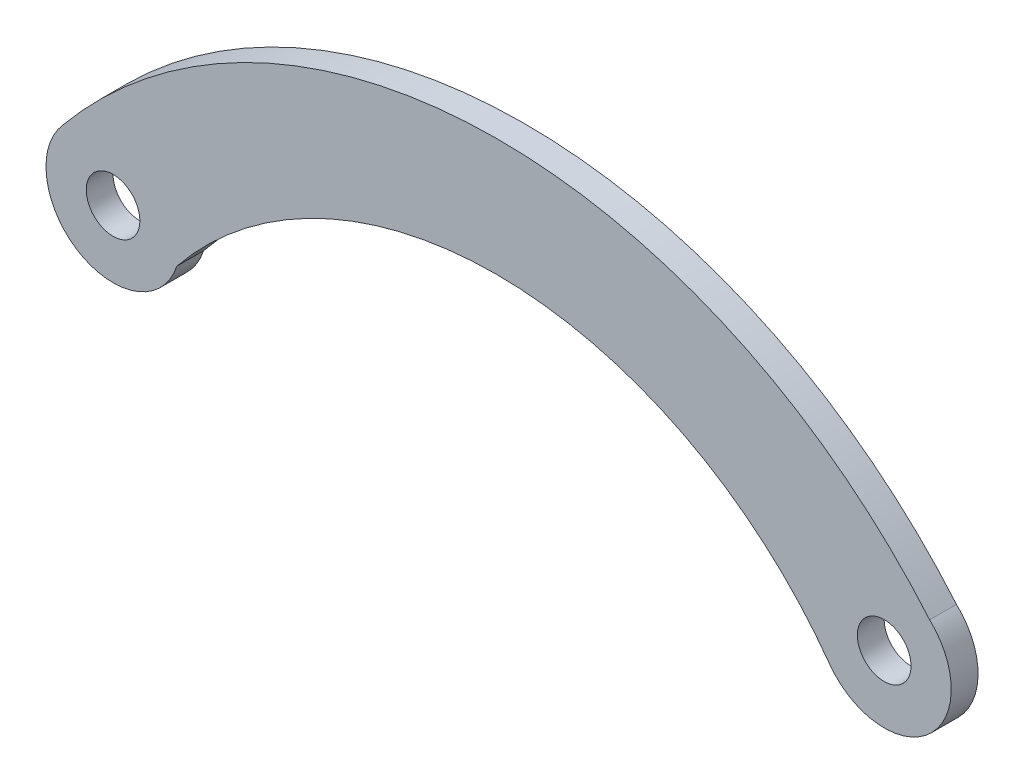
ISO-10303-21;
HEADER;
FILE_DESCRIPTION(('STEP AP214'),'2;1');
FILE_NAME('part.step','',(''),(''),'','','');
FILE_SCHEMA(('AUTOMOTIVE_DESIGN { 1 0 10303 214 1 1 1 1 }'));
ENDSEC;
DATA;
#1=APPLICATION_CONTEXT('core data for automotive mechanical design processes');
#2=APPLICATION_PROTOCOL_DEFINITION('international standard','automotive_design',2000,#1);
#3=PRODUCT_CONTEXT('',#1,'mechanical');
#4=PRODUCT('Part','Part','',(#3));
#5=PRODUCT_RELATED_PRODUCT_CATEGORY('part','',(#4));
#6=PRODUCT_DEFINITION_FORMATION('','',#4);
#7=PRODUCT_DEFINITION_CONTEXT('part definition',#1,'design');
#8=PRODUCT_DEFINITION('design','',#6,#7);
#9=PRODUCT_DEFINITION_SHAPE('','',#8);
#10=(LENGTH_UNIT() NAMED_UNIT(*) SI_UNIT(.MILLI.,.METRE.));
#11=(NAMED_UNIT(*) PLANE_ANGLE_UNIT() SI_UNIT($,.RADIAN.));
#12=(NAMED_UNIT(*) SI_UNIT($,.STERADIAN.) SOLID_ANGLE_UNIT());
#13=UNCERTAINTY_MEASURE_WITH_UNIT(LENGTH_MEASURE(1.E-05),#10,'distance_accuracy_value','');
#14=(GEOMETRIC_REPRESENTATION_CONTEXT(3) GLOBAL_UNCERTAINTY_ASSIGNED_CONTEXT((#13)) GLOBAL_UNIT_ASSIGNED_CONTEXT((#10,
#11,#12)) REPRESENTATION_CONTEXT('',''));
#15=CARTESIAN_POINT('',(0.,0.,0.));
#16=DIRECTION('',(0.,0.,1.));
#17=DIRECTION('',(1.,0.,0.));
#18=AXIS2_PLACEMENT_3D('',#15,#16,#17);
#19=CARTESIAN_POINT('',(14.2885472241432,-10.3836236230563,2.));
#20=DIRECTION('',(0.,0.,1.));
#21=DIRECTION('',(1.,0.,0.));
#22=AXIS2_PLACEMENT_3D('',#19,#20,#21);
#23=PLANE('',#22);
#24=CARTESIAN_POINT('',(0.,0.,2.));
#25=DIRECTION('',(0.,0.,1.));
#26=DIRECTION('',(1.,0.,0.));
#27=AXIS2_PLACEMENT_3D('',#24,#25,#26);
#28=CIRCLE('',#27,2.);
#29=CARTESIAN_POINT('',(2.,0.,2.));
#30=VERTEX_POINT('',#29);
#31=EDGE_CURVE('E100',#30,#30,#28,.T.);
#32=ORIENTED_EDGE('',*,*,#31,.F.);
#33=EDGE_LOOP('',(#32));
#34=FACE_BOUND('',#33,.T.);
#35=CARTESIAN_POINT('',(0.,0.,2.));
#36=DIRECTION('',(0.,0.,1.));
#37=DIRECTION('',(1.,0.,0.));
#38=AXIS2_PLACEMENT_3D('',#35,#36,#37);
#39=CIRCLE('',#38,5.);
#40=CARTESIAN_POINT('',(-3.74273707494906,3.31540633826409,2.));
#41=VERTEX_POINT('',#40);
#42=CARTESIAN_POINT('',(4.75213831706475,-1.55472872729779,2.));
#43=VERTEX_POINT('',#42);
#44=EDGE_CURVE('E85',#41,#43,#39,.T.);
#45=ORIENTED_EDGE('',*,*,#44,.T.);
#46=CARTESIAN_POINT('',(28.5770944482863,-20.7672472461125,2.));
#47=DIRECTION('',(0.,0.,-1.));
#48=DIRECTION('',(1.,0.,0.));
#49=AXIS2_PLACEMENT_3D('',#46,#47,#48);
#50=CIRCLE('',#49,30.6063621244086);
#51=CARTESIAN_POINT('',(53.4385199966993,-2.91622704582285,2.));
#52=VERTEX_POINT('',#51);
#53=EDGE_CURVE('E80',#43,#52,#50,.T.);
#54=ORIENTED_EDGE('',*,*,#53,.T.);
#55=CARTESIAN_POINT('',(57.5,0.,2.));
#56=DIRECTION('',(0.,0.,1.));
#57=DIRECTION('',(1.,0.,0.));
#58=AXIS2_PLACEMENT_3D('',#55,#56,#57);
#59=CIRCLE('',#58,5.00000000000001);
#60=CARTESIAN_POINT('',(60.8904334548438,3.67490965715842,2.));
#61=VERTEX_POINT('',#60);
#62=EDGE_CURVE('E83',#52,#61,#59,.T.);
#63=ORIENTED_EDGE('',*,*,#62,.T.);
#64=CARTESIAN_POINT('',(28.723841666284,-23.4713633802719,2.));
#65=DIRECTION('',(0.,0.,1.));
#66=DIRECTION('',(1.,0.,0.));
#67=AXIS2_PLACEMENT_3D('',#64,#65,#66);
#68=CIRCLE('',#67,42.0904949735039);
#69=EDGE_CURVE('E50',#61,#41,#68,.T.);
#70=ORIENTED_EDGE('',*,*,#69,.T.);
#71=EDGE_LOOP('',(#45,#54,#63,#70));
#72=FACE_BOUND('',#71,.T.);
#73=CARTESIAN_POINT('',(57.5,0.,2.));
#74=DIRECTION('',(0.,0.,1.));
#75=DIRECTION('',(1.,0.,0.));
#76=AXIS2_PLACEMENT_3D('',#73,#74,#75);
#77=CIRCLE('',#76,2.);
#78=CARTESIAN_POINT('',(59.5,0.,2.));
#79=VERTEX_POINT('',#78);
#80=EDGE_CURVE('E115',#79,#79,#77,.T.);
#81=ORIENTED_EDGE('',*,*,#80,.F.);
#82=EDGE_LOOP('',(#81));
#83=FACE_BOUND('',#82,.T.);
#84=ADVANCED_FACE('F33',(#34,#72,#83),#23,.T.);
#85=CARTESIAN_POINT('',(14.2885472241432,-10.3836236230563,0.));
#86=DIRECTION('',(0.,0.,1.));
#87=DIRECTION('',(1.,0.,0.));
#88=AXIS2_PLACEMENT_3D('',#85,#86,#87);
#89=PLANE('',#88);
#90=CARTESIAN_POINT('',(0.,0.,0.));
#91=DIRECTION('',(0.,0.,1.));
#92=DIRECTION('',(1.,0.,0.));
#93=AXIS2_PLACEMENT_3D('',#90,#91,#92);
#94=CIRCLE('',#93,2.);
#95=CARTESIAN_POINT('',(2.,0.,0.));
#96=VERTEX_POINT('',#95);
#97=EDGE_CURVE('E112',#96,#96,#94,.T.);
#98=ORIENTED_EDGE('',*,*,#97,.T.);
#99=EDGE_LOOP('',(#98));
#100=FACE_BOUND('',#99,.T.);
#101=CARTESIAN_POINT('',(0.,0.,0.));
#102=DIRECTION('',(0.,0.,1.));
#103=DIRECTION('',(1.,0.,0.));
#104=AXIS2_PLACEMENT_3D('',#101,#102,#103);
#105=CIRCLE('',#104,5.);
#106=CARTESIAN_POINT('',(-3.74273707494906,3.31540633826409,0.));
#107=VERTEX_POINT('',#106);
#108=CARTESIAN_POINT('',(4.75213831706475,-1.55472872729779,0.));
#109=VERTEX_POINT('',#108);
#110=EDGE_CURVE('E97',#107,#109,#105,.T.);
#111=ORIENTED_EDGE('',*,*,#110,.F.);
#112=CARTESIAN_POINT('',(28.723841666284,-23.4713633802719,0.));
#113=DIRECTION('',(0.,0.,1.));
#114=DIRECTION('',(1.,0.,0.));
#115=AXIS2_PLACEMENT_3D('',#112,#113,#114);
#116=CIRCLE('',#115,42.0904949735039);
#117=CARTESIAN_POINT('',(60.8904334548438,3.67490965715842,0.));
#118=VERTEX_POINT('',#117);
#119=EDGE_CURVE('E73',#118,#107,#116,.T.);
#120=ORIENTED_EDGE('',*,*,#119,.F.);
#121=CARTESIAN_POINT('',(57.5,0.,0.));
#122=DIRECTION('',(0.,0.,1.));
#123=DIRECTION('',(1.,0.,0.));
#124=AXIS2_PLACEMENT_3D('',#121,#122,#123);
#125=CIRCLE('',#124,5.00000000000001);
#126=CARTESIAN_POINT('',(53.4385199966993,-2.91622704582285,0.));
#127=VERTEX_POINT('',#126);
#128=EDGE_CURVE('E67',#127,#118,#125,.T.);
#129=ORIENTED_EDGE('',*,*,#128,.F.);
#130=CARTESIAN_POINT('',(28.5770944482863,-20.7672472461125,0.));
#131=DIRECTION('',(0.,0.,-1.));
#132=DIRECTION('',(1.,0.,0.));
#133=AXIS2_PLACEMENT_3D('',#130,#131,#132);
#134=CIRCLE('',#133,30.6063621244086);
#135=EDGE_CURVE('E89',#109,#127,#134,.T.);
#136=ORIENTED_EDGE('',*,*,#135,.F.);
#137=EDGE_LOOP('',(#111,#120,#129,#136));
#138=FACE_BOUND('',#137,.T.);
#139=CARTESIAN_POINT('',(57.5,0.,0.));
#140=DIRECTION('',(0.,0.,1.));
#141=DIRECTION('',(1.,0.,0.));
#142=AXIS2_PLACEMENT_3D('',#139,#140,#141);
#143=CIRCLE('',#142,2.);
#144=CARTESIAN_POINT('',(59.5,0.,0.));
#145=VERTEX_POINT('',#144);
#146=EDGE_CURVE('E118',#145,#145,#143,.T.);
#147=ORIENTED_EDGE('',*,*,#146,.T.);
#148=EDGE_LOOP('',(#147));
#149=FACE_BOUND('',#148,.T.);
#150=ADVANCED_FACE('F108',(#100,#138,#149),#89,.F.);
#151=CARTESIAN_POINT('',(0.,0.,2.));
#152=DIRECTION('',(0.,0.,-1.));
#153=DIRECTION('',(-1.,0.,0.));
#154=AXIS2_PLACEMENT_3D('',#151,#152,#153);
#155=CYLINDRICAL_SURFACE('',#154,5.);
#156=ORIENTED_EDGE('',*,*,#110,.T.);
#157=DIRECTION('',(0.,0.,-1.));
#158=VECTOR('',#157,1.);
#159=CARTESIAN_POINT('',(4.75213831706475,-1.55472872729779,2.));
#160=LINE('',#159,#158);
#161=EDGE_CURVE('E11',#43,#109,#160,.T.);
#162=ORIENTED_EDGE('',*,*,#161,.F.);
#163=ORIENTED_EDGE('',*,*,#44,.F.);
#164=DIRECTION('',(0.,0.,-1.));
#165=VECTOR('',#164,1.);
#166=CARTESIAN_POINT('',(-3.74273707494906,3.31540633826409,2.));
#167=LINE('',#166,#165);
#168=EDGE_CURVE('E93',#41,#107,#167,.T.);
#169=ORIENTED_EDGE('',*,*,#168,.T.);
#170=EDGE_LOOP('',(#156,#162,#163,#169));
#171=FACE_BOUND('',#170,.T.);
#172=ADVANCED_FACE('F35',(#171),#155,.T.);
#173=CARTESIAN_POINT('',(28.5770944482863,-20.7672472461125,2.));
#174=DIRECTION('',(0.,0.,-1.));
#175=DIRECTION('',(-1.,0.,0.));
#176=AXIS2_PLACEMENT_3D('',#173,#174,#175);
#177=CYLINDRICAL_SURFACE('',#176,30.6063621244086);
#178=ORIENTED_EDGE('',*,*,#135,.T.);
#179=DIRECTION('',(0.,0.,-1.));
#180=VECTOR('',#179,1.);
#181=CARTESIAN_POINT('',(53.4385199966993,-2.91622704582285,2.));
#182=LINE('',#181,#180);
#183=EDGE_CURVE('E42',#52,#127,#182,.T.);
#184=ORIENTED_EDGE('',*,*,#183,.F.);
#185=ORIENTED_EDGE('',*,*,#53,.F.);
#186=ORIENTED_EDGE('',*,*,#161,.T.);
#187=EDGE_LOOP('',(#178,#184,#185,#186));
#188=FACE_BOUND('',#187,.T.);
#189=ADVANCED_FACE('F88',(#188),#177,.F.);
#190=CARTESIAN_POINT('',(57.5,0.,2.));
#191=DIRECTION('',(0.,0.,-1.));
#192=DIRECTION('',(-1.,0.,0.));
#193=AXIS2_PLACEMENT_3D('',#190,#191,#192);
#194=CYLINDRICAL_SURFACE('',#193,5.00000000000001);
#195=ORIENTED_EDGE('',*,*,#128,.T.);
#196=DIRECTION('',(0.,0.,-1.));
#197=VECTOR('',#196,1.);
#198=CARTESIAN_POINT('',(60.8904334548438,3.67490965715842,2.));
#199=LINE('',#198,#197);
#200=EDGE_CURVE('E90',#61,#118,#199,.T.);
#201=ORIENTED_EDGE('',*,*,#200,.F.);
#202=ORIENTED_EDGE('',*,*,#62,.F.);
#203=ORIENTED_EDGE('',*,*,#183,.T.);
#204=EDGE_LOOP('',(#195,#201,#202,#203));
#205=FACE_BOUND('',#204,.T.);
#206=ADVANCED_FACE('F91',(#205),#194,.T.);
#207=CARTESIAN_POINT('',(28.723841666284,-23.4713633802719,2.));
#208=DIRECTION('',(0.,0.,-1.));
#209=DIRECTION('',(-1.,0.,0.));
#210=AXIS2_PLACEMENT_3D('',#207,#208,#209);
#211=CYLINDRICAL_SURFACE('',#210,42.0904949735039);
#212=ORIENTED_EDGE('',*,*,#119,.T.);
#213=ORIENTED_EDGE('',*,*,#168,.F.);
#214=ORIENTED_EDGE('',*,*,#69,.F.);
#215=ORIENTED_EDGE('',*,*,#200,.T.);
#216=EDGE_LOOP('',(#212,#213,#214,#215));
#217=FACE_BOUND('',#216,.T.);
#218=ADVANCED_FACE('F105',(#217),#211,.T.);
#219=CARTESIAN_POINT('',(0.,0.,2.));
#220=DIRECTION('',(0.,0.,-1.));
#221=DIRECTION('',(-1.,0.,0.));
#222=AXIS2_PLACEMENT_3D('',#219,#220,#221);
#223=CYLINDRICAL_SURFACE('',#222,2.);
#224=ORIENTED_EDGE('',*,*,#31,.T.);
#225=EDGE_LOOP('',(#224));
#226=FACE_BOUND('',#225,.T.);
#227=ORIENTED_EDGE('',*,*,#97,.F.);
#228=EDGE_LOOP('',(#227));
#229=FACE_BOUND('',#228,.T.);
#230=ADVANCED_FACE('F136',(#226,#229),#223,.F.);
#231=CARTESIAN_POINT('',(57.5,0.,2.));
#232=DIRECTION('',(0.,0.,-1.));
#233=DIRECTION('',(-1.,0.,0.));
#234=AXIS2_PLACEMENT_3D('',#231,#232,#233);
#235=CYLINDRICAL_SURFACE('',#234,2.);
#236=ORIENTED_EDGE('',*,*,#80,.T.);
#237=EDGE_LOOP('',(#236));
#238=FACE_BOUND('',#237,.T.);
#239=ORIENTED_EDGE('',*,*,#146,.F.);
#240=EDGE_LOOP('',(#239));
#241=FACE_BOUND('',#240,.T.);
#242=ADVANCED_FACE('F124',(#238,#241),#235,.F.);
#243=CLOSED_SHELL('',(#84,#150,#172,#189,#206,#218,#230,#242));
#244=MANIFOLD_SOLID_BREP('B2',#243);
#245=ADVANCED_BREP_SHAPE_REPRESENTATION('',(#18,#244),#14);
#246=SHAPE_DEFINITION_REPRESENTATION(#9,#245);
ENDSEC;
END-ISO-10303-21;
